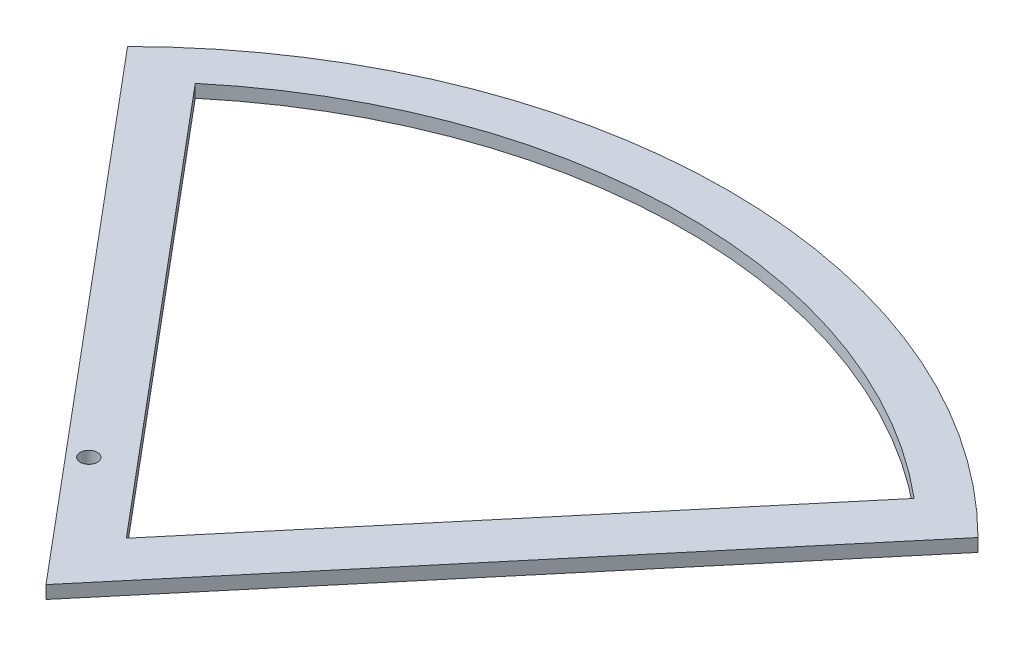
ISO-10303-21;
HEADER;
FILE_DESCRIPTION(('STEP AP214'),'2;1');
FILE_NAME('part.step','',(''),(''),'','','');
FILE_SCHEMA(('AUTOMOTIVE_DESIGN { 1 0 10303 214 1 1 1 1 }'));
ENDSEC;
DATA;
#1=APPLICATION_CONTEXT('core data for automotive mechanical design processes');
#2=APPLICATION_PROTOCOL_DEFINITION('international standard','automotive_design',2000,#1);
#3=PRODUCT_CONTEXT('',#1,'mechanical');
#4=PRODUCT('Part','Part','',(#3));
#5=PRODUCT_RELATED_PRODUCT_CATEGORY('part','',(#4));
#6=PRODUCT_DEFINITION_FORMATION('','',#4);
#7=PRODUCT_DEFINITION_CONTEXT('part definition',#1,'design');
#8=PRODUCT_DEFINITION('design','',#6,#7);
#9=PRODUCT_DEFINITION_SHAPE('','',#8);
#10=(LENGTH_UNIT() NAMED_UNIT(*) SI_UNIT(.MILLI.,.METRE.));
#11=(NAMED_UNIT(*) PLANE_ANGLE_UNIT() SI_UNIT($,.RADIAN.));
#12=(NAMED_UNIT(*) SI_UNIT($,.STERADIAN.) SOLID_ANGLE_UNIT());
#13=UNCERTAINTY_MEASURE_WITH_UNIT(LENGTH_MEASURE(1.E-05),#10,'distance_accuracy_value','');
#14=(GEOMETRIC_REPRESENTATION_CONTEXT(3) GLOBAL_UNCERTAINTY_ASSIGNED_CONTEXT((#13)) GLOBAL_UNIT_ASSIGNED_CONTEXT((#10,
#11,#12)) REPRESENTATION_CONTEXT('',''));
#15=CARTESIAN_POINT('',(0.,0.,0.));
#16=DIRECTION('',(0.,0.,1.));
#17=DIRECTION('',(1.,0.,0.));
#18=AXIS2_PLACEMENT_3D('',#15,#16,#17);
#19=CARTESIAN_POINT('',(0.,1.5,0.));
#20=DIRECTION('',(0.,-1.,0.));
#21=DIRECTION('',(0.,0.,-1.));
#22=AXIS2_PLACEMENT_3D('',#19,#20,#21);
#23=PLANE('',#22);
#24=CARTESIAN_POINT('',(-20.6495691235205,1.5,-11.9324854805143));
#25=DIRECTION('',(0.,1.,0.));
#26=DIRECTION('',(0.,0.,1.));
#27=AXIS2_PLACEMENT_3D('',#24,#25,#26);
#28=CIRCLE('',#27,2.);
#29=CARTESIAN_POINT('',(-20.6495691235205,1.5,-9.93248548051429));
#30=VERTEX_POINT('',#29);
#31=EDGE_CURVE('E209',#30,#30,#28,.T.);
#32=ORIENTED_EDGE('',*,*,#31,.F.);
#33=EDGE_LOOP('',(#32));
#34=FACE_BOUND('',#33,.T.);
#35=CARTESIAN_POINT('',(0.,1.5,0.));
#36=DIRECTION('',(0.,1.,0.));
#37=DIRECTION('',(0.,0.,-1.));
#38=AXIS2_PLACEMENT_3D('',#35,#36,#37);
#39=CIRCLE('',#38,140.);
#40=CARTESIAN_POINT('',(98.8516127665059,1.5,-99.13807872589));
#41=VERTEX_POINT('',#40);
#42=CARTESIAN_POINT('',(-98.851612766506,1.5,-99.13807872589));
#43=VERTEX_POINT('',#42);
#44=EDGE_CURVE('E134',#41,#43,#39,.T.);
#45=ORIENTED_EDGE('',*,*,#44,.T.);
#46=DIRECTION('',(0.642787609686541,0.,0.766044443118977));
#47=VECTOR('',#46,1.);
#48=CARTESIAN_POINT('',(-98.851612766506,1.5,-99.13807872589));
#49=LINE('',#48,#47);
#50=CARTESIAN_POINT('',(0.,1.5,18.6686859223249));
#51=VERTEX_POINT('',#50);
#52=EDGE_CURVE('E138',#43,#51,#49,.T.);
#53=ORIENTED_EDGE('',*,*,#52,.T.);
#54=DIRECTION('',(0.64278760968654,0.,-0.766044443118977));
#55=VECTOR('',#54,1.);
#56=CARTESIAN_POINT('',(98.8516127665059,1.5,-99.13807872589));
#57=LINE('',#56,#55);
#58=EDGE_CURVE('E142',#51,#41,#57,.T.);
#59=ORIENTED_EDGE('',*,*,#58,.T.);
#60=EDGE_LOOP('',(#45,#53,#59));
#61=FACE_BOUND('',#60,.T.);
#62=DIRECTION('',(0.64278760968654,0.,-0.766044443118977));
#63=VECTOR('',#62,1.);
#64=CARTESIAN_POINT('',(0.,1.5,0.));
#65=LINE('',#64,#63);
#66=CARTESIAN_POINT('',(0.,1.5,0.));
#67=VERTEX_POINT('',#66);
#68=CARTESIAN_POINT('',(83.5623892592502,1.5,-99.5857776054671));
#69=VERTEX_POINT('',#68);
#70=EDGE_CURVE('E97',#67,#69,#65,.T.);
#71=ORIENTED_EDGE('',*,*,#70,.F.);
#72=DIRECTION('',(0.64278760968654,0.,0.766044443118977));
#73=VECTOR('',#72,1.);
#74=CARTESIAN_POINT('',(0.,1.5,0.));
#75=LINE('',#74,#73);
#76=CARTESIAN_POINT('',(-83.5623892592503,1.5,-99.585777605467));
#77=VERTEX_POINT('',#76);
#78=EDGE_CURVE('E115',#77,#67,#75,.T.);
#79=ORIENTED_EDGE('',*,*,#78,.F.);
#80=CARTESIAN_POINT('',(0.,1.5,0.));
#81=DIRECTION('',(0.,1.,0.));
#82=DIRECTION('',(0.,0.,-1.));
#83=AXIS2_PLACEMENT_3D('',#80,#81,#82);
#84=CIRCLE('',#83,130.);
#85=EDGE_CURVE('E106',#69,#77,#84,.T.);
#86=ORIENTED_EDGE('',*,*,#85,.F.);
#87=EDGE_LOOP('',(#71,#79,#86));
#88=FACE_BOUND('',#87,.T.);
#89=ADVANCED_FACE('F39',(#34,#61,#88),#23,.F.);
#90=CARTESIAN_POINT('',(0.,-1.5,0.));
#91=DIRECTION('',(0.,-1.,0.));
#92=DIRECTION('',(0.,0.,-1.));
#93=AXIS2_PLACEMENT_3D('',#90,#91,#92);
#94=PLANE('',#93);
#95=CARTESIAN_POINT('',(-20.6495691235205,-1.5,-11.9324854805143));
#96=DIRECTION('',(0.,1.,0.));
#97=DIRECTION('',(0.,0.,1.));
#98=AXIS2_PLACEMENT_3D('',#95,#96,#97);
#99=CIRCLE('',#98,2.);
#100=CARTESIAN_POINT('',(-20.6495691235205,-1.5,-9.93248548051429));
#101=VERTEX_POINT('',#100);
#102=EDGE_CURVE('E126',#101,#101,#99,.T.);
#103=ORIENTED_EDGE('',*,*,#102,.T.);
#104=EDGE_LOOP('',(#103));
#105=FACE_BOUND('',#104,.T.);
#106=DIRECTION('',(0.642787609686541,0.,0.766044443118977));
#107=VECTOR('',#106,1.);
#108=CARTESIAN_POINT('',(-98.851612766506,-1.5,-99.13807872589));
#109=LINE('',#108,#107);
#110=CARTESIAN_POINT('',(-98.851612766506,-1.5,-99.13807872589));
#111=VERTEX_POINT('',#110);
#112=CARTESIAN_POINT('',(0.,-1.5,18.6686859223249));
#113=VERTEX_POINT('',#112);
#114=EDGE_CURVE('E113',#111,#113,#109,.T.);
#115=ORIENTED_EDGE('',*,*,#114,.F.);
#116=CARTESIAN_POINT('',(0.,-1.5,0.));
#117=DIRECTION('',(0.,1.,0.));
#118=DIRECTION('',(0.,0.,-1.));
#119=AXIS2_PLACEMENT_3D('',#116,#117,#118);
#120=CIRCLE('',#119,140.);
#121=CARTESIAN_POINT('',(98.8516127665059,-1.5,-99.13807872589));
#122=VERTEX_POINT('',#121);
#123=EDGE_CURVE('E139',#122,#111,#120,.T.);
#124=ORIENTED_EDGE('',*,*,#123,.F.);
#125=DIRECTION('',(0.64278760968654,0.,-0.766044443118977));
#126=VECTOR('',#125,1.);
#127=CARTESIAN_POINT('',(98.8516127665059,-1.5,-99.13807872589));
#128=LINE('',#127,#126);
#129=EDGE_CURVE('E148',#113,#122,#128,.T.);
#130=ORIENTED_EDGE('',*,*,#129,.F.);
#131=EDGE_LOOP('',(#115,#124,#130));
#132=FACE_BOUND('',#131,.T.);
#133=DIRECTION('',(0.64278760968654,0.,0.766044443118977));
#134=VECTOR('',#133,1.);
#135=CARTESIAN_POINT('',(0.,-1.5,0.));
#136=LINE('',#135,#134);
#137=CARTESIAN_POINT('',(-83.5623892592503,-1.5,-99.585777605467));
#138=VERTEX_POINT('',#137);
#139=CARTESIAN_POINT('',(0.,-1.5,0.));
#140=VERTEX_POINT('',#139);
#141=EDGE_CURVE('E107',#138,#140,#136,.T.);
#142=ORIENTED_EDGE('',*,*,#141,.T.);
#143=DIRECTION('',(0.64278760968654,0.,-0.766044443118977));
#144=VECTOR('',#143,1.);
#145=CARTESIAN_POINT('',(0.,-1.5,0.));
#146=LINE('',#145,#144);
#147=CARTESIAN_POINT('',(83.5623892592502,-1.5,-99.5857776054671));
#148=VERTEX_POINT('',#147);
#149=EDGE_CURVE('E65',#140,#148,#146,.T.);
#150=ORIENTED_EDGE('',*,*,#149,.T.);
#151=CARTESIAN_POINT('',(0.,-1.5,0.));
#152=DIRECTION('',(0.,1.,0.));
#153=DIRECTION('',(0.,0.,-1.));
#154=AXIS2_PLACEMENT_3D('',#151,#152,#153);
#155=CIRCLE('',#154,130.);
#156=EDGE_CURVE('E112',#148,#138,#155,.T.);
#157=ORIENTED_EDGE('',*,*,#156,.T.);
#158=EDGE_LOOP('',(#142,#150,#157));
#159=FACE_BOUND('',#158,.T.);
#160=ADVANCED_FACE('F165',(#105,#132,#159),#94,.T.);
#161=CARTESIAN_POINT('',(-98.851612766506,1.5,-99.13807872589));
#162=DIRECTION('',(0.766044443118977,0.,-0.642787609686541));
#163=DIRECTION('',(-0.642787609686541,0.,-0.766044443118977));
#164=AXIS2_PLACEMENT_3D('',#161,#162,#163);
#165=PLANE('',#164);
#166=ORIENTED_EDGE('',*,*,#114,.T.);
#167=DIRECTION('',(0.,-1.,0.));
#168=VECTOR('',#167,1.);
#169=CARTESIAN_POINT('',(0.,1.5,18.6686859223249));
#170=LINE('',#169,#168);
#171=EDGE_CURVE('E48',#51,#113,#170,.T.);
#172=ORIENTED_EDGE('',*,*,#171,.F.);
#173=ORIENTED_EDGE('',*,*,#52,.F.);
#174=DIRECTION('',(0.,-1.,0.));
#175=VECTOR('',#174,1.);
#176=CARTESIAN_POINT('',(-98.851612766506,1.5,-99.13807872589));
#177=LINE('',#176,#175);
#178=EDGE_CURVE('E11',#43,#111,#177,.T.);
#179=ORIENTED_EDGE('',*,*,#178,.T.);
#180=EDGE_LOOP('',(#166,#172,#173,#179));
#181=FACE_BOUND('',#180,.T.);
#182=ADVANCED_FACE('F41',(#181),#165,.F.);
#183=CARTESIAN_POINT('',(98.8516127665059,1.5,-99.13807872589));
#184=DIRECTION('',(-0.766044443118978,0.,-0.64278760968654));
#185=DIRECTION('',(-0.64278760968654,0.,0.766044443118977));
#186=AXIS2_PLACEMENT_3D('',#183,#184,#185);
#187=PLANE('',#186);
#188=ORIENTED_EDGE('',*,*,#129,.T.);
#189=DIRECTION('',(0.,-1.,0.));
#190=VECTOR('',#189,1.);
#191=CARTESIAN_POINT('',(98.8516127665059,1.5,-99.13807872589));
#192=LINE('',#191,#190);
#193=EDGE_CURVE('E145',#41,#122,#192,.T.);
#194=ORIENTED_EDGE('',*,*,#193,.F.);
#195=ORIENTED_EDGE('',*,*,#58,.F.);
#196=ORIENTED_EDGE('',*,*,#171,.T.);
#197=EDGE_LOOP('',(#188,#194,#195,#196));
#198=FACE_BOUND('',#197,.T.);
#199=ADVANCED_FACE('F160',(#198),#187,.F.);
#200=CARTESIAN_POINT('',(0.,1.5,0.));
#201=DIRECTION('',(0.,-1.,0.));
#202=DIRECTION('',(0.,0.,-1.));
#203=AXIS2_PLACEMENT_3D('',#200,#201,#202);
#204=CYLINDRICAL_SURFACE('',#203,140.);
#205=ORIENTED_EDGE('',*,*,#123,.T.);
#206=ORIENTED_EDGE('',*,*,#178,.F.);
#207=ORIENTED_EDGE('',*,*,#44,.F.);
#208=ORIENTED_EDGE('',*,*,#193,.T.);
#209=EDGE_LOOP('',(#205,#206,#207,#208));
#210=FACE_BOUND('',#209,.T.);
#211=ADVANCED_FACE('F169',(#210),#204,.T.);
#212=CARTESIAN_POINT('',(0.,1.5,0.));
#213=DIRECTION('',(-0.766044443118977,0.,-0.64278760968654));
#214=DIRECTION('',(-0.64278760968654,0.,0.766044443118977));
#215=AXIS2_PLACEMENT_3D('',#212,#213,#214);
#216=PLANE('',#215);
#217=ORIENTED_EDGE('',*,*,#149,.F.);
#218=DIRECTION('',(0.,-1.,0.));
#219=VECTOR('',#218,1.);
#220=CARTESIAN_POINT('',(0.,1.5,0.));
#221=LINE('',#220,#219);
#222=EDGE_CURVE('E101',#67,#140,#221,.T.);
#223=ORIENTED_EDGE('',*,*,#222,.F.);
#224=ORIENTED_EDGE('',*,*,#70,.T.);
#225=DIRECTION('',(0.,-1.,0.));
#226=VECTOR('',#225,1.);
#227=CARTESIAN_POINT('',(83.5623892592502,1.5,-99.5857776054671));
#228=LINE('',#227,#226);
#229=EDGE_CURVE('E100',#69,#148,#228,.T.);
#230=ORIENTED_EDGE('',*,*,#229,.T.);
#231=EDGE_LOOP('',(#217,#223,#224,#230));
#232=FACE_BOUND('',#231,.T.);
#233=ADVANCED_FACE('F99',(#232),#216,.T.);
#234=CARTESIAN_POINT('',(0.,1.5,0.));
#235=DIRECTION('',(0.,-1.,0.));
#236=DIRECTION('',(0.,0.,-1.));
#237=AXIS2_PLACEMENT_3D('',#234,#235,#236);
#238=CYLINDRICAL_SURFACE('',#237,130.);
#239=ORIENTED_EDGE('',*,*,#156,.F.);
#240=ORIENTED_EDGE('',*,*,#229,.F.);
#241=ORIENTED_EDGE('',*,*,#85,.T.);
#242=DIRECTION('',(0.,-1.,0.));
#243=VECTOR('',#242,1.);
#244=CARTESIAN_POINT('',(-83.5623892592503,1.5,-99.585777605467));
#245=LINE('',#244,#243);
#246=EDGE_CURVE('E57',#77,#138,#245,.T.);
#247=ORIENTED_EDGE('',*,*,#246,.T.);
#248=EDGE_LOOP('',(#239,#240,#241,#247));
#249=FACE_BOUND('',#248,.T.);
#250=ADVANCED_FACE('F110',(#249),#238,.F.);
#251=CARTESIAN_POINT('',(0.,1.5,0.));
#252=DIRECTION('',(0.766044443118977,0.,-0.64278760968654));
#253=DIRECTION('',(-0.64278760968654,0.,-0.766044443118977));
#254=AXIS2_PLACEMENT_3D('',#251,#252,#253);
#255=PLANE('',#254);
#256=ORIENTED_EDGE('',*,*,#141,.F.);
#257=ORIENTED_EDGE('',*,*,#246,.F.);
#258=ORIENTED_EDGE('',*,*,#78,.T.);
#259=ORIENTED_EDGE('',*,*,#222,.T.);
#260=EDGE_LOOP('',(#256,#257,#258,#259));
#261=FACE_BOUND('',#260,.T.);
#262=ADVANCED_FACE('F194',(#261),#255,.T.);
#263=CARTESIAN_POINT('',(-20.6495691235205,1.5,-11.9324854805143));
#264=DIRECTION('',(0.,1.,0.));
#265=DIRECTION('',(0.,0.,1.));
#266=AXIS2_PLACEMENT_3D('',#263,#264,#265);
#267=CYLINDRICAL_SURFACE('',#266,2.);
#268=ORIENTED_EDGE('',*,*,#102,.F.);
#269=EDGE_LOOP('',(#268));
#270=FACE_BOUND('',#269,.T.);
#271=ORIENTED_EDGE('',*,*,#31,.T.);
#272=EDGE_LOOP('',(#271));
#273=FACE_BOUND('',#272,.T.);
#274=ADVANCED_FACE('F198',(#270,#273),#267,.F.);
#275=CLOSED_SHELL('',(#89,#160,#182,#199,#211,#233,#250,#262,#274));
#276=MANIFOLD_SOLID_BREP('B2',#275);
#277=ADVANCED_BREP_SHAPE_REPRESENTATION('',(#18,#276),#14);
#278=SHAPE_DEFINITION_REPRESENTATION(#9,#277);
ENDSEC;
END-ISO-10303-21;
